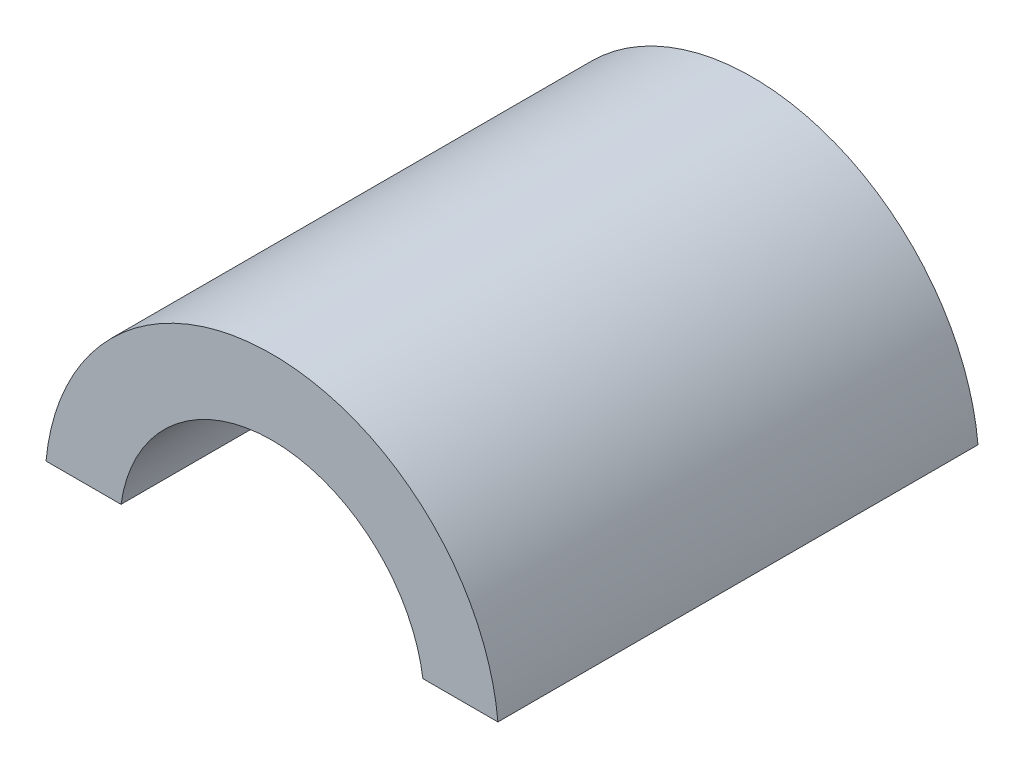
ISO-10303-21;
HEADER;
FILE_DESCRIPTION(('STEP AP214'),'2;1');
FILE_NAME('part.step','',(''),(''),'','','');
FILE_SCHEMA(('AUTOMOTIVE_DESIGN { 1 0 10303 214 1 1 1 1 }'));
ENDSEC;
DATA;
#1=APPLICATION_CONTEXT('core data for automotive mechanical design processes');
#2=APPLICATION_PROTOCOL_DEFINITION('international standard','automotive_design',2000,#1);
#3=PRODUCT_CONTEXT('',#1,'mechanical');
#4=PRODUCT('Part','Part','',(#3));
#5=PRODUCT_RELATED_PRODUCT_CATEGORY('part','',(#4));
#6=PRODUCT_DEFINITION_FORMATION('','',#4);
#7=PRODUCT_DEFINITION_CONTEXT('part definition',#1,'design');
#8=PRODUCT_DEFINITION('design','',#6,#7);
#9=PRODUCT_DEFINITION_SHAPE('','',#8);
#10=(LENGTH_UNIT() NAMED_UNIT(*) SI_UNIT(.MILLI.,.METRE.));
#11=(NAMED_UNIT(*) PLANE_ANGLE_UNIT() SI_UNIT($,.RADIAN.));
#12=(NAMED_UNIT(*) SI_UNIT($,.STERADIAN.) SOLID_ANGLE_UNIT());
#13=UNCERTAINTY_MEASURE_WITH_UNIT(LENGTH_MEASURE(1.E-05),#10,'distance_accuracy_value','');
#14=(GEOMETRIC_REPRESENTATION_CONTEXT(3) GLOBAL_UNCERTAINTY_ASSIGNED_CONTEXT((#13)) GLOBAL_UNIT_ASSIGNED_CONTEXT((#10,
#11,#12)) REPRESENTATION_CONTEXT('',''));
#15=CARTESIAN_POINT('',(0.,0.,0.));
#16=DIRECTION('',(0.,0.,1.));
#17=DIRECTION('',(1.,0.,0.));
#18=AXIS2_PLACEMENT_3D('',#15,#16,#17);
#19=CARTESIAN_POINT('',(0.,3.87906157215844,-7.86));
#20=DIRECTION('',(0.,0.,-1.));
#21=DIRECTION('',(0.,-1.,0.));
#22=AXIS2_PLACEMENT_3D('',#19,#20,#21);
#23=PLANE('',#22);
#24=CARTESIAN_POINT('',(0.,0.,-7.86));
#25=DIRECTION('',(0.,0.,1.));
#26=DIRECTION('',(1.,0.,0.));
#27=AXIS2_PLACEMENT_3D('',#24,#25,#26);
#28=CIRCLE('',#27,7.09137314431688);
#29=CARTESIAN_POINT('',(7.05995874700686,0.66675,-7.86));
#30=VERTEX_POINT('',#29);
#31=CARTESIAN_POINT('',(-7.05995874700687,0.66675,-7.86));
#32=VERTEX_POINT('',#31);
#33=EDGE_CURVE('E11',#30,#32,#28,.T.);
#34=ORIENTED_EDGE('',*,*,#33,.T.);
#35=DIRECTION('',(1.,0.,0.));
#36=VECTOR('',#35,1.);
#37=CARTESIAN_POINT('',(-7.05995874700687,0.66675,-7.86));
#38=LINE('',#37,#36);
#39=CARTESIAN_POINT('',(-4.71559653569938,0.66675,-7.86));
#40=VERTEX_POINT('',#39);
#41=EDGE_CURVE('E112',#32,#40,#38,.T.);
#42=ORIENTED_EDGE('',*,*,#41,.T.);
#43=CARTESIAN_POINT('',(0.,0.,-7.86));
#44=DIRECTION('',(0.,0.,-1.));
#45=DIRECTION('',(-0.990151503558925,0.14,0.));
#46=AXIS2_PLACEMENT_3D('',#43,#44,#45);
#47=CIRCLE('',#46,4.7625);
#48=CARTESIAN_POINT('',(4.71559653569938,0.66675,-7.86));
#49=VERTEX_POINT('',#48);
#50=EDGE_CURVE('E99',#40,#49,#47,.T.);
#51=ORIENTED_EDGE('',*,*,#50,.T.);
#52=DIRECTION('',(1.,0.,0.));
#53=VECTOR('',#52,1.);
#54=CARTESIAN_POINT('',(7.05995874700686,0.66675,-7.86));
#55=LINE('',#54,#53);
#56=EDGE_CURVE('E84',#49,#30,#55,.T.);
#57=ORIENTED_EDGE('',*,*,#56,.T.);
#58=EDGE_LOOP('',(#34,#42,#51,#57));
#59=FACE_BOUND('',#58,.T.);
#60=ADVANCED_FACE('F17',(#59),#23,.F.);
#61=CARTESIAN_POINT('',(0.,3.87906157215844,-22.86));
#62=DIRECTION('',(0.,0.,-1.));
#63=DIRECTION('',(0.,-1.,0.));
#64=AXIS2_PLACEMENT_3D('',#61,#62,#63);
#65=PLANE('',#64);
#66=CARTESIAN_POINT('',(0.,0.,-22.86));
#67=DIRECTION('',(0.,0.,-1.));
#68=DIRECTION('',(1.,0.,0.));
#69=AXIS2_PLACEMENT_3D('',#66,#67,#68);
#70=CIRCLE('',#69,7.09137314431688);
#71=CARTESIAN_POINT('',(-7.05995874700686,0.66675,-22.86));
#72=VERTEX_POINT('',#71);
#73=CARTESIAN_POINT('',(7.05995874700686,0.66675,-22.86));
#74=VERTEX_POINT('',#73);
#75=EDGE_CURVE('E27',#72,#74,#70,.T.);
#76=ORIENTED_EDGE('',*,*,#75,.T.);
#77=DIRECTION('',(-1.,0.,0.));
#78=VECTOR('',#77,1.);
#79=CARTESIAN_POINT('',(7.05995874700686,0.66675,-22.86));
#80=LINE('',#79,#78);
#81=CARTESIAN_POINT('',(4.71559653569938,0.66675,-22.86));
#82=VERTEX_POINT('',#81);
#83=EDGE_CURVE('E73',#74,#82,#80,.T.);
#84=ORIENTED_EDGE('',*,*,#83,.T.);
#85=CARTESIAN_POINT('',(0.,0.,-22.86));
#86=DIRECTION('',(0.,0.,-1.));
#87=DIRECTION('',(-0.990151503558925,0.14,0.));
#88=AXIS2_PLACEMENT_3D('',#85,#86,#87);
#89=CIRCLE('',#88,4.7625);
#90=CARTESIAN_POINT('',(-4.71559653569938,0.66675,-22.86));
#91=VERTEX_POINT('',#90);
#92=EDGE_CURVE('E105',#91,#82,#89,.T.);
#93=ORIENTED_EDGE('',*,*,#92,.F.);
#94=DIRECTION('',(1.,0.,0.));
#95=VECTOR('',#94,1.);
#96=CARTESIAN_POINT('',(-7.05995874700686,0.66675,-22.86));
#97=LINE('',#96,#95);
#98=EDGE_CURVE('E72',#72,#91,#97,.T.);
#99=ORIENTED_EDGE('',*,*,#98,.F.);
#100=EDGE_LOOP('',(#76,#84,#93,#99));
#101=FACE_BOUND('',#100,.T.);
#102=ADVANCED_FACE('F68',(#101),#65,.T.);
#103=CARTESIAN_POINT('',(0.,0.,-22.86));
#104=DIRECTION('',(0.,0.,1.));
#105=DIRECTION('',(1.,0.,0.));
#106=AXIS2_PLACEMENT_3D('',#103,#104,#105);
#107=CYLINDRICAL_SURFACE('',#106,7.09137314431688);
#108=ORIENTED_EDGE('',*,*,#75,.F.);
#109=DIRECTION('',(0.,0.,1.));
#110=VECTOR('',#109,1.);
#111=CARTESIAN_POINT('',(-7.05995874700686,0.66675,-22.86));
#112=LINE('',#111,#110);
#113=EDGE_CURVE('E76',#72,#32,#112,.T.);
#114=ORIENTED_EDGE('',*,*,#113,.T.);
#115=ORIENTED_EDGE('',*,*,#33,.F.);
#116=DIRECTION('',(0.,0.,1.));
#117=VECTOR('',#116,1.);
#118=CARTESIAN_POINT('',(7.05995874700686,0.66675,-22.86));
#119=LINE('',#118,#117);
#120=EDGE_CURVE('E78',#74,#30,#119,.T.);
#121=ORIENTED_EDGE('',*,*,#120,.F.);
#122=EDGE_LOOP('',(#108,#114,#115,#121));
#123=FACE_BOUND('',#122,.T.);
#124=ADVANCED_FACE('F19',(#123),#107,.T.);
#125=CARTESIAN_POINT('',(-7.05995874700686,0.66675,-22.86));
#126=DIRECTION('',(0.,-1.,0.));
#127=DIRECTION('',(0.,0.,-1.));
#128=AXIS2_PLACEMENT_3D('',#125,#126,#127);
#129=PLANE('',#128);
#130=ORIENTED_EDGE('',*,*,#98,.T.);
#131=DIRECTION('',(0.,0.,1.));
#132=VECTOR('',#131,1.);
#133=CARTESIAN_POINT('',(-4.71559653569938,0.66675,-22.86));
#134=LINE('',#133,#132);
#135=EDGE_CURVE('E96',#91,#40,#134,.T.);
#136=ORIENTED_EDGE('',*,*,#135,.T.);
#137=ORIENTED_EDGE('',*,*,#41,.F.);
#138=ORIENTED_EDGE('',*,*,#113,.F.);
#139=EDGE_LOOP('',(#130,#136,#137,#138));
#140=FACE_BOUND('',#139,.T.);
#141=ADVANCED_FACE('F120',(#140),#129,.T.);
#142=CARTESIAN_POINT('',(0.,0.,-22.86));
#143=DIRECTION('',(0.,0.,1.));
#144=DIRECTION('',(-0.990151503558925,0.14,0.));
#145=AXIS2_PLACEMENT_3D('',#142,#143,#144);
#146=CYLINDRICAL_SURFACE('',#145,4.7625);
#147=ORIENTED_EDGE('',*,*,#92,.T.);
#148=DIRECTION('',(0.,0.,1.));
#149=VECTOR('',#148,1.);
#150=CARTESIAN_POINT('',(4.71559653569938,0.66675,-22.86));
#151=LINE('',#150,#149);
#152=EDGE_CURVE('E86',#82,#49,#151,.T.);
#153=ORIENTED_EDGE('',*,*,#152,.T.);
#154=ORIENTED_EDGE('',*,*,#50,.F.);
#155=ORIENTED_EDGE('',*,*,#135,.F.);
#156=EDGE_LOOP('',(#147,#153,#154,#155));
#157=FACE_BOUND('',#156,.T.);
#158=ADVANCED_FACE('F121',(#157),#146,.F.);
#159=CARTESIAN_POINT('',(4.71559653569938,0.66675,-22.86));
#160=DIRECTION('',(0.,-1.,0.));
#161=DIRECTION('',(0.,0.,-1.));
#162=AXIS2_PLACEMENT_3D('',#159,#160,#161);
#163=PLANE('',#162);
#164=ORIENTED_EDGE('',*,*,#83,.F.);
#165=ORIENTED_EDGE('',*,*,#120,.T.);
#166=ORIENTED_EDGE('',*,*,#56,.F.);
#167=ORIENTED_EDGE('',*,*,#152,.F.);
#168=EDGE_LOOP('',(#164,#165,#166,#167));
#169=FACE_BOUND('',#168,.T.);
#170=ADVANCED_FACE('F88',(#169),#163,.T.);
#171=CLOSED_SHELL('',(#60,#102,#124,#141,#158,#170));
#172=MANIFOLD_SOLID_BREP('B1',#171);
#173=ADVANCED_BREP_SHAPE_REPRESENTATION('',(#18,#172),#14);
#174=SHAPE_DEFINITION_REPRESENTATION(#9,#173);
ENDSEC;
END-ISO-10303-21;
